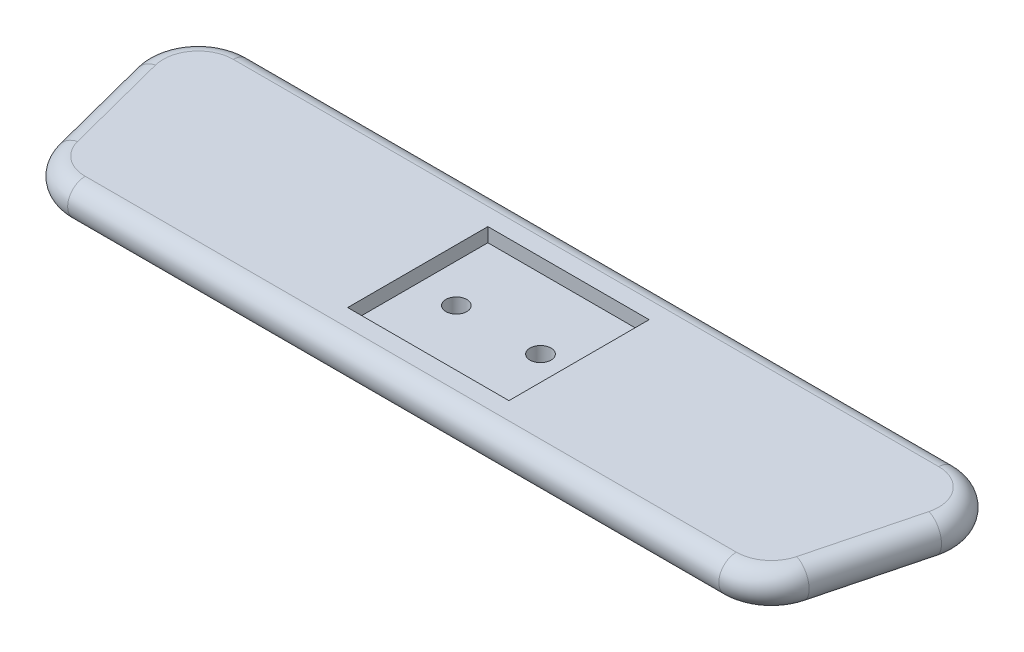
ISO-10303-21;
HEADER;
FILE_DESCRIPTION(('STEP AP214'),'2;1');
FILE_NAME('part.step','',(''),(''),'','','');
FILE_SCHEMA(('AUTOMOTIVE_DESIGN { 1 0 10303 214 1 1 1 1 }'));
ENDSEC;
DATA;
#1=APPLICATION_CONTEXT('core data for automotive mechanical design processes');
#2=APPLICATION_PROTOCOL_DEFINITION('international standard','automotive_design',2000,#1);
#3=PRODUCT_CONTEXT('',#1,'mechanical');
#4=PRODUCT('Part','Part','',(#3));
#5=PRODUCT_RELATED_PRODUCT_CATEGORY('part','',(#4));
#6=PRODUCT_DEFINITION_FORMATION('','',#4);
#7=PRODUCT_DEFINITION_CONTEXT('part definition',#1,'design');
#8=PRODUCT_DEFINITION('design','',#6,#7);
#9=PRODUCT_DEFINITION_SHAPE('','',#8);
#10=(LENGTH_UNIT() NAMED_UNIT(*) SI_UNIT(.MILLI.,.METRE.));
#11=(NAMED_UNIT(*) PLANE_ANGLE_UNIT() SI_UNIT($,.RADIAN.));
#12=(NAMED_UNIT(*) SI_UNIT($,.STERADIAN.) SOLID_ANGLE_UNIT());
#13=UNCERTAINTY_MEASURE_WITH_UNIT(LENGTH_MEASURE(1.E-05),#10,'distance_accuracy_value','');
#14=(GEOMETRIC_REPRESENTATION_CONTEXT(3) GLOBAL_UNCERTAINTY_ASSIGNED_CONTEXT((#13)) GLOBAL_UNIT_ASSIGNED_CONTEXT((#10,
#11,#12)) REPRESENTATION_CONTEXT('',''));
#15=CARTESIAN_POINT('',(0.,0.,0.));
#16=DIRECTION('',(0.,0.,1.));
#17=DIRECTION('',(1.,0.,0.));
#18=AXIS2_PLACEMENT_3D('',#15,#16,#17);
#19=CARTESIAN_POINT('',(-92.8687040210194,5.,25.));
#20=DIRECTION('',(1.,0.,0.));
#21=DIRECTION('',(0.,0.,-1.));
#22=AXIS2_PLACEMENT_3D('',#19,#20,#21);
#23=CYLINDRICAL_SURFACE('',#22,5.);
#24=CARTESIAN_POINT('',(92.8687040210193,5.,25.));
#25=DIRECTION('',(1.,0.,0.));
#26=DIRECTION('',(0.,0.,-1.));
#27=AXIS2_PLACEMENT_3D('',#24,#25,#26);
#28=CIRCLE('',#27,5.);
#29=CARTESIAN_POINT('',(92.8687040210193,10.,25.));
#30=VERTEX_POINT('',#29);
#31=CARTESIAN_POINT('',(92.8687040210193,0.,25.));
#32=VERTEX_POINT('',#31);
#33=EDGE_CURVE('E11',#30,#32,#28,.T.);
#34=ORIENTED_EDGE('',*,*,#33,.F.);
#35=DIRECTION('',(-1.,0.,0.));
#36=VECTOR('',#35,1.);
#37=CARTESIAN_POINT('',(-92.8687040210194,10.,25.));
#38=LINE('',#37,#36);
#39=CARTESIAN_POINT('',(-92.8687040210194,10.,25.));
#40=VERTEX_POINT('',#39);
#41=EDGE_CURVE('E165',#40,#30,#38,.F.);
#42=ORIENTED_EDGE('',*,*,#41,.F.);
#43=CARTESIAN_POINT('',(-92.8687040210194,5.,25.));
#44=DIRECTION('',(1.,0.,0.));
#45=DIRECTION('',(0.,0.,-1.));
#46=AXIS2_PLACEMENT_3D('',#43,#44,#45);
#47=CIRCLE('',#46,5.);
#48=CARTESIAN_POINT('',(-92.8687040210194,0.,25.));
#49=VERTEX_POINT('',#48);
#50=EDGE_CURVE('E42',#40,#49,#47,.T.);
#51=ORIENTED_EDGE('',*,*,#50,.T.);
#52=DIRECTION('',(1.,0.,0.));
#53=VECTOR('',#52,1.);
#54=CARTESIAN_POINT('',(-100.627231551696,0.,25.));
#55=LINE('',#54,#53);
#56=EDGE_CURVE('E198',#32,#49,#55,.F.);
#57=ORIENTED_EDGE('',*,*,#56,.F.);
#58=EDGE_LOOP('',(#34,#42,#51,#57));
#59=FACE_BOUND('',#58,.T.);
#60=ADVANCED_FACE('F34',(#59),#23,.T.);
#61=CARTESIAN_POINT('',(-92.8687040210195,5.,15.));
#62=DIRECTION('',(0.,1.,0.));
#63=DIRECTION('',(0.,0.,1.));
#64=AXIS2_PLACEMENT_3D('',#61,#62,#63);
#65=TOROIDAL_SURFACE('',#64,10.,5.);
#66=ORIENTED_EDGE('',*,*,#50,.F.);
#67=CARTESIAN_POINT('',(-92.8687040210195,10.,15.));
#68=DIRECTION('',(0.,1.,0.));
#69=DIRECTION('',(0.,0.,1.));
#70=AXIS2_PLACEMENT_3D('',#67,#68,#69);
#71=CIRCLE('',#70,10.);
#72=CARTESIAN_POINT('',(-102.550180424801,10.,17.5038000405444));
#73=VERTEX_POINT('',#72);
#74=EDGE_CURVE('E177',#73,#40,#71,.T.);
#75=ORIENTED_EDGE('',*,*,#74,.F.);
#76=CARTESIAN_POINT('',(-102.550180424801,5.,17.5038000405444));
#77=DIRECTION('',(0.250380004054439,0.,0.968147640378108));
#78=DIRECTION('',(0.968147640378108,0.,-0.250380004054439));
#79=AXIS2_PLACEMENT_3D('',#76,#77,#78);
#80=CIRCLE('',#79,5.);
#81=CARTESIAN_POINT('',(-102.550180424801,0.,17.5038000405444));
#82=VERTEX_POINT('',#81);
#83=EDGE_CURVE('E230',#73,#82,#80,.T.);
#84=ORIENTED_EDGE('',*,*,#83,.T.);
#85=CARTESIAN_POINT('',(-92.8687040210195,0.,15.));
#86=DIRECTION('',(0.,1.,0.));
#87=DIRECTION('',(0.,0.,1.));
#88=AXIS2_PLACEMENT_3D('',#85,#86,#87);
#89=CIRCLE('',#88,10.);
#90=EDGE_CURVE('E201',#49,#82,#89,.F.);
#91=ORIENTED_EDGE('',*,*,#90,.F.);
#92=EDGE_LOOP('',(#66,#75,#84,#91));
#93=FACE_BOUND('',#92,.T.);
#94=ADVANCED_FACE('F237',(#93),#65,.T.);
#95=CARTESIAN_POINT('',(-110.308707955477,5.,-12.4961999594555));
#96=DIRECTION('',(0.250380004054446,0.,0.968147640378107));
#97=DIRECTION('',(0.968147640378107,0.,-0.250380004054446));
#98=AXIS2_PLACEMENT_3D('',#95,#96,#97);
#99=CYLINDRICAL_SURFACE('',#98,5.);
#100=ORIENTED_EDGE('',*,*,#83,.F.);
#101=DIRECTION('',(-0.250380004054446,0.,-0.968147640378107));
#102=VECTOR('',#101,1.);
#103=CARTESIAN_POINT('',(-110.308707955477,10.,-12.4961999594555));
#104=LINE('',#103,#102);
#105=CARTESIAN_POINT('',(-110.308707955477,10.,-12.4961999594555));
#106=VERTEX_POINT('',#105);
#107=EDGE_CURVE('E180',#106,#73,#104,.F.);
#108=ORIENTED_EDGE('',*,*,#107,.F.);
#109=CARTESIAN_POINT('',(-110.308707955477,5.,-12.4961999594555));
#110=DIRECTION('',(0.250380004054454,0.,0.968147640378105));
#111=DIRECTION('',(0.968147640378105,0.,-0.250380004054454));
#112=AXIS2_PLACEMENT_3D('',#109,#110,#111);
#113=CIRCLE('',#112,5.);
#114=CARTESIAN_POINT('',(-110.308707955477,0.,-12.4961999594555));
#115=VERTEX_POINT('',#114);
#116=EDGE_CURVE('E228',#106,#115,#113,.T.);
#117=ORIENTED_EDGE('',*,*,#116,.T.);
#118=DIRECTION('',(0.250380004054446,0.,0.968147640378107));
#119=VECTOR('',#118,1.);
#120=CARTESIAN_POINT('',(-110.308707955477,0.,-12.4961999594555));
#121=LINE('',#120,#119);
#122=EDGE_CURVE('E204',#82,#115,#121,.F.);
#123=ORIENTED_EDGE('',*,*,#122,.F.);
#124=EDGE_LOOP('',(#100,#108,#117,#123));
#125=FACE_BOUND('',#124,.T.);
#126=ADVANCED_FACE('F251',(#125),#99,.T.);
#127=CARTESIAN_POINT('',(-100.627231551696,5.,-15.));
#128=DIRECTION('',(0.,1.,0.));
#129=DIRECTION('',(0.,0.,1.));
#130=AXIS2_PLACEMENT_3D('',#127,#128,#129);
#131=TOROIDAL_SURFACE('',#130,10.,5.);
#132=ORIENTED_EDGE('',*,*,#116,.F.);
#133=CARTESIAN_POINT('',(-100.627231551696,10.,-15.));
#134=DIRECTION('',(0.,1.,0.));
#135=DIRECTION('',(0.,0.,1.));
#136=AXIS2_PLACEMENT_3D('',#133,#134,#135);
#137=CIRCLE('',#136,10.);
#138=CARTESIAN_POINT('',(-100.627231551696,10.,-25.));
#139=VERTEX_POINT('',#138);
#140=EDGE_CURVE('E183',#139,#106,#137,.T.);
#141=ORIENTED_EDGE('',*,*,#140,.F.);
#142=CARTESIAN_POINT('',(-100.627231551696,5.,-25.));
#143=DIRECTION('',(-1.,0.,0.));
#144=DIRECTION('',(0.,0.,1.));
#145=AXIS2_PLACEMENT_3D('',#142,#143,#144);
#146=CIRCLE('',#145,5.);
#147=CARTESIAN_POINT('',(-100.627231551696,0.,-25.));
#148=VERTEX_POINT('',#147);
#149=EDGE_CURVE('E226',#139,#148,#146,.T.);
#150=ORIENTED_EDGE('',*,*,#149,.T.);
#151=CARTESIAN_POINT('',(-100.627231551696,0.,-15.));
#152=DIRECTION('',(0.,1.,0.));
#153=DIRECTION('',(0.,0.,1.));
#154=AXIS2_PLACEMENT_3D('',#151,#152,#153);
#155=CIRCLE('',#154,10.);
#156=EDGE_CURVE('E207',#115,#148,#155,.F.);
#157=ORIENTED_EDGE('',*,*,#156,.F.);
#158=EDGE_LOOP('',(#132,#141,#150,#157));
#159=FACE_BOUND('',#158,.T.);
#160=ADVANCED_FACE('F255',(#159),#131,.T.);
#161=CARTESIAN_POINT('',(100.627231551696,5.,-25.));
#162=DIRECTION('',(-1.,0.,0.));
#163=DIRECTION('',(0.,0.,1.));
#164=AXIS2_PLACEMENT_3D('',#161,#162,#163);
#165=CYLINDRICAL_SURFACE('',#164,5.);
#166=ORIENTED_EDGE('',*,*,#149,.F.);
#167=DIRECTION('',(-1.,0.,0.));
#168=VECTOR('',#167,1.);
#169=CARTESIAN_POINT('',(-100.627231551696,10.,-25.));
#170=LINE('',#169,#168);
#171=CARTESIAN_POINT('',(100.627231551696,10.,-25.));
#172=VERTEX_POINT('',#171);
#173=EDGE_CURVE('E186',#172,#139,#170,.T.);
#174=ORIENTED_EDGE('',*,*,#173,.F.);
#175=CARTESIAN_POINT('',(100.627231551696,5.,-25.));
#176=DIRECTION('',(-1.,0.,0.));
#177=DIRECTION('',(0.,0.,1.));
#178=AXIS2_PLACEMENT_3D('',#175,#176,#177);
#179=CIRCLE('',#178,5.);
#180=CARTESIAN_POINT('',(100.627231551696,0.,-25.));
#181=VERTEX_POINT('',#180);
#182=EDGE_CURVE('E224',#172,#181,#179,.T.);
#183=ORIENTED_EDGE('',*,*,#182,.T.);
#184=DIRECTION('',(1.,0.,0.));
#185=VECTOR('',#184,1.);
#186=CARTESIAN_POINT('',(100.627231551696,0.,-25.));
#187=LINE('',#186,#185);
#188=EDGE_CURVE('E210',#148,#181,#187,.T.);
#189=ORIENTED_EDGE('',*,*,#188,.F.);
#190=EDGE_LOOP('',(#166,#174,#183,#189));
#191=FACE_BOUND('',#190,.T.);
#192=ADVANCED_FACE('F258',(#191),#165,.T.);
#193=CARTESIAN_POINT('',(100.627231551696,5.,-15.));
#194=DIRECTION('',(0.,1.,0.));
#195=DIRECTION('',(0.,0.,1.));
#196=AXIS2_PLACEMENT_3D('',#193,#194,#195);
#197=TOROIDAL_SURFACE('',#196,10.,5.);
#198=ORIENTED_EDGE('',*,*,#182,.F.);
#199=CARTESIAN_POINT('',(100.627231551696,10.,-15.));
#200=DIRECTION('',(0.,1.,0.));
#201=DIRECTION('',(0.,0.,1.));
#202=AXIS2_PLACEMENT_3D('',#199,#200,#201);
#203=CIRCLE('',#202,10.);
#204=CARTESIAN_POINT('',(110.308707955477,10.,-12.4961999594554));
#205=VERTEX_POINT('',#204);
#206=EDGE_CURVE('E189',#205,#172,#203,.T.);
#207=ORIENTED_EDGE('',*,*,#206,.F.);
#208=CARTESIAN_POINT('',(110.308707955477,5.,-12.4961999594554));
#209=DIRECTION('',(0.250380004054446,0.,-0.968147640378107));
#210=DIRECTION('',(-0.968147640378107,0.,-0.250380004054446));
#211=AXIS2_PLACEMENT_3D('',#208,#209,#210);
#212=CIRCLE('',#211,5.);
#213=CARTESIAN_POINT('',(110.308707955477,0.,-12.4961999594554));
#214=VERTEX_POINT('',#213);
#215=EDGE_CURVE('E57',#205,#214,#212,.T.);
#216=ORIENTED_EDGE('',*,*,#215,.T.);
#217=CARTESIAN_POINT('',(100.627231551696,0.,-15.));
#218=DIRECTION('',(0.,1.,0.));
#219=DIRECTION('',(0.,0.,1.));
#220=AXIS2_PLACEMENT_3D('',#217,#218,#219);
#221=CIRCLE('',#220,10.);
#222=EDGE_CURVE('E213',#181,#214,#221,.F.);
#223=ORIENTED_EDGE('',*,*,#222,.F.);
#224=EDGE_LOOP('',(#198,#207,#216,#223));
#225=FACE_BOUND('',#224,.T.);
#226=ADVANCED_FACE('F259',(#225),#197,.T.);
#227=CARTESIAN_POINT('',(102.5501804248,5.,17.5038000405444));
#228=DIRECTION('',(0.250380004054446,0.,-0.968147640378107));
#229=DIRECTION('',(-0.968147640378107,0.,-0.250380004054446));
#230=AXIS2_PLACEMENT_3D('',#227,#228,#229);
#231=CYLINDRICAL_SURFACE('',#230,5.);
#232=ORIENTED_EDGE('',*,*,#215,.F.);
#233=DIRECTION('',(0.250380004054446,0.,-0.968147640378107));
#234=VECTOR('',#233,1.);
#235=CARTESIAN_POINT('',(97.6920361937733,10.,36.2888499555633));
#236=LINE('',#235,#234);
#237=CARTESIAN_POINT('',(102.5501804248,10.,17.5038000405444));
#238=VERTEX_POINT('',#237);
#239=EDGE_CURVE('E192',#238,#205,#236,.T.);
#240=ORIENTED_EDGE('',*,*,#239,.F.);
#241=CARTESIAN_POINT('',(102.5501804248,5.,17.5038000405444));
#242=DIRECTION('',(0.25038000405444,0.,-0.968147640378108));
#243=DIRECTION('',(-0.968147640378108,0.,-0.25038000405444));
#244=AXIS2_PLACEMENT_3D('',#241,#242,#243);
#245=CIRCLE('',#244,5.);
#246=CARTESIAN_POINT('',(102.5501804248,0.,17.5038000405444));
#247=VERTEX_POINT('',#246);
#248=EDGE_CURVE('E49',#238,#247,#245,.T.);
#249=ORIENTED_EDGE('',*,*,#248,.T.);
#250=DIRECTION('',(-0.250380004054446,0.,0.968147640378107));
#251=VECTOR('',#250,1.);
#252=CARTESIAN_POINT('',(102.5501804248,0.,17.5038000405444));
#253=LINE('',#252,#251);
#254=EDGE_CURVE('E216',#214,#247,#253,.T.);
#255=ORIENTED_EDGE('',*,*,#254,.F.);
#256=EDGE_LOOP('',(#232,#240,#249,#255));
#257=FACE_BOUND('',#256,.T.);
#258=ADVANCED_FACE('F261',(#257),#231,.T.);
#259=CARTESIAN_POINT('',(92.8687040210194,5.,15.));
#260=DIRECTION('',(0.,1.,0.));
#261=DIRECTION('',(0.,0.,1.));
#262=AXIS2_PLACEMENT_3D('',#259,#260,#261);
#263=TOROIDAL_SURFACE('',#262,10.,5.);
#264=CARTESIAN_POINT('',(92.8687040210194,10.,15.));
#265=DIRECTION('',(0.,1.,0.));
#266=DIRECTION('',(0.,0.,1.));
#267=AXIS2_PLACEMENT_3D('',#264,#265,#266);
#268=CIRCLE('',#267,10.);
#269=EDGE_CURVE('E195',#30,#238,#268,.T.);
#270=ORIENTED_EDGE('',*,*,#269,.F.);
#271=ORIENTED_EDGE('',*,*,#33,.T.);
#272=CARTESIAN_POINT('',(92.8687040210194,0.,15.));
#273=DIRECTION('',(0.,1.,0.));
#274=DIRECTION('',(0.,0.,1.));
#275=AXIS2_PLACEMENT_3D('',#272,#273,#274);
#276=CIRCLE('',#275,10.);
#277=EDGE_CURVE('E219',#247,#32,#276,.F.);
#278=ORIENTED_EDGE('',*,*,#277,.F.);
#279=ORIENTED_EDGE('',*,*,#248,.F.);
#280=EDGE_LOOP('',(#270,#271,#278,#279));
#281=FACE_BOUND('',#280,.T.);
#282=ADVANCED_FACE('F244',(#281),#263,.T.);
#283=CARTESIAN_POINT('',(-100.627231551696,10.,-15.));
#284=DIRECTION('',(0.,1.,0.));
#285=DIRECTION('',(0.,0.,1.));
#286=AXIS2_PLACEMENT_3D('',#283,#284,#285);
#287=PLANE('',#286);
#288=ORIENTED_EDGE('',*,*,#41,.T.);
#289=ORIENTED_EDGE('',*,*,#269,.T.);
#290=ORIENTED_EDGE('',*,*,#239,.T.);
#291=ORIENTED_EDGE('',*,*,#206,.T.);
#292=ORIENTED_EDGE('',*,*,#173,.T.);
#293=ORIENTED_EDGE('',*,*,#140,.T.);
#294=ORIENTED_EDGE('',*,*,#107,.T.);
#295=ORIENTED_EDGE('',*,*,#74,.T.);
#296=EDGE_LOOP('',(#288,#289,#290,#291,#292,#293,#294,#295));
#297=FACE_BOUND('',#296,.T.);
#298=DIRECTION('',(0.,0.,1.));
#299=VECTOR('',#298,1.);
#300=CARTESIAN_POINT('',(-23.,10.,-20.));
#301=LINE('',#300,#299);
#302=CARTESIAN_POINT('',(-23.,10.,-20.));
#303=VERTEX_POINT('',#302);
#304=CARTESIAN_POINT('',(-23.,10.,20.));
#305=VERTEX_POINT('',#304);
#306=EDGE_CURVE('E129',#303,#305,#301,.T.);
#307=ORIENTED_EDGE('',*,*,#306,.F.);
#308=DIRECTION('',(1.,0.,0.));
#309=VECTOR('',#308,1.);
#310=CARTESIAN_POINT('',(-23.,10.,-20.));
#311=LINE('',#310,#309);
#312=CARTESIAN_POINT('',(23.,10.,-20.));
#313=VERTEX_POINT('',#312);
#314=EDGE_CURVE('E146',#303,#313,#311,.T.);
#315=ORIENTED_EDGE('',*,*,#314,.T.);
#316=DIRECTION('',(0.,0.,1.));
#317=VECTOR('',#316,1.);
#318=CARTESIAN_POINT('',(23.,10.,-20.));
#319=LINE('',#318,#317);
#320=CARTESIAN_POINT('',(23.,10.,20.));
#321=VERTEX_POINT('',#320);
#322=EDGE_CURVE('E149',#313,#321,#319,.T.);
#323=ORIENTED_EDGE('',*,*,#322,.T.);
#324=DIRECTION('',(1.,0.,0.));
#325=VECTOR('',#324,1.);
#326=CARTESIAN_POINT('',(-23.,10.,20.));
#327=LINE('',#326,#325);
#328=EDGE_CURVE('E158',#305,#321,#327,.T.);
#329=ORIENTED_EDGE('',*,*,#328,.F.);
#330=EDGE_LOOP('',(#307,#315,#323,#329));
#331=FACE_BOUND('',#330,.T.);
#332=ADVANCED_FACE('F246',(#297,#331),#287,.T.);
#333=CARTESIAN_POINT('',(-100.627231551696,0.,-15.));
#334=DIRECTION('',(0.,1.,0.));
#335=DIRECTION('',(0.,0.,1.));
#336=AXIS2_PLACEMENT_3D('',#333,#334,#335);
#337=PLANE('',#336);
#338=CARTESIAN_POINT('',(70.,0.,8.));
#339=DIRECTION('',(0.,-1.,0.));
#340=DIRECTION('',(0.,0.,1.));
#341=AXIS2_PLACEMENT_3D('',#338,#339,#340);
#342=CIRCLE('',#341,2.);
#343=CARTESIAN_POINT('',(70.,0.,10.));
#344=VERTEX_POINT('',#343);
#345=EDGE_CURVE('E385',#344,#344,#342,.T.);
#346=ORIENTED_EDGE('',*,*,#345,.F.);
#347=EDGE_LOOP('',(#346));
#348=FACE_BOUND('',#347,.T.);
#349=CARTESIAN_POINT('',(70.,0.,-8.));
#350=DIRECTION('',(0.,-1.,0.));
#351=DIRECTION('',(0.,0.,-1.));
#352=AXIS2_PLACEMENT_3D('',#349,#350,#351);
#353=CIRCLE('',#352,2.);
#354=CARTESIAN_POINT('',(70.,0.,-10.));
#355=VERTEX_POINT('',#354);
#356=EDGE_CURVE('E379',#355,#355,#353,.T.);
#357=ORIENTED_EDGE('',*,*,#356,.F.);
#358=EDGE_LOOP('',(#357));
#359=FACE_BOUND('',#358,.T.);
#360=CARTESIAN_POINT('',(-70.,0.,-8.));
#361=DIRECTION('',(0.,-1.,0.));
#362=DIRECTION('',(0.,0.,1.));
#363=AXIS2_PLACEMENT_3D('',#360,#361,#362);
#364=CIRCLE('',#363,2.);
#365=CARTESIAN_POINT('',(-70.,0.,-6.));
#366=VERTEX_POINT('',#365);
#367=EDGE_CURVE('E368',#366,#366,#364,.T.);
#368=ORIENTED_EDGE('',*,*,#367,.F.);
#369=EDGE_LOOP('',(#368));
#370=FACE_BOUND('',#369,.T.);
#371=CARTESIAN_POINT('',(-70.,0.,8.));
#372=DIRECTION('',(0.,-1.,0.));
#373=DIRECTION('',(0.,0.,-1.));
#374=AXIS2_PLACEMENT_3D('',#371,#372,#373);
#375=CIRCLE('',#374,2.);
#376=CARTESIAN_POINT('',(-70.,0.,6.));
#377=VERTEX_POINT('',#376);
#378=EDGE_CURVE('E367',#377,#377,#375,.T.);
#379=ORIENTED_EDGE('',*,*,#378,.F.);
#380=EDGE_LOOP('',(#379));
#381=FACE_BOUND('',#380,.T.);
#382=ORIENTED_EDGE('',*,*,#254,.T.);
#383=ORIENTED_EDGE('',*,*,#277,.T.);
#384=ORIENTED_EDGE('',*,*,#56,.T.);
#385=ORIENTED_EDGE('',*,*,#90,.T.);
#386=ORIENTED_EDGE('',*,*,#122,.T.);
#387=ORIENTED_EDGE('',*,*,#156,.T.);
#388=ORIENTED_EDGE('',*,*,#188,.T.);
#389=ORIENTED_EDGE('',*,*,#222,.T.);
#390=EDGE_LOOP('',(#382,#383,#384,#385,#386,#387,#388,#389));
#391=FACE_BOUND('',#390,.T.);
#392=CARTESIAN_POINT('',(-12.,0.,0.));
#393=DIRECTION('',(0.,1.,0.));
#394=DIRECTION('',(0.,0.,1.));
#395=AXIS2_PLACEMENT_3D('',#392,#393,#394);
#396=CIRCLE('',#395,3.);
#397=CARTESIAN_POINT('',(-12.,0.,3.));
#398=VERTEX_POINT('',#397);
#399=EDGE_CURVE('E172',#398,#398,#396,.T.);
#400=ORIENTED_EDGE('',*,*,#399,.T.);
#401=EDGE_LOOP('',(#400));
#402=FACE_BOUND('',#401,.T.);
#403=CARTESIAN_POINT('',(12.,0.,0.));
#404=DIRECTION('',(0.,1.,0.));
#405=DIRECTION('',(0.,0.,1.));
#406=AXIS2_PLACEMENT_3D('',#403,#404,#405);
#407=CIRCLE('',#406,3.);
#408=CARTESIAN_POINT('',(12.,0.,3.));
#409=VERTEX_POINT('',#408);
#410=EDGE_CURVE('E152',#409,#409,#407,.T.);
#411=ORIENTED_EDGE('',*,*,#410,.T.);
#412=EDGE_LOOP('',(#411));
#413=FACE_BOUND('',#412,.T.);
#414=ADVANCED_FACE('F240',(#348,#359,#370,#381,#391,#402,#413),#337,.F.);
#415=CARTESIAN_POINT('',(-23.,6.,-20.));
#416=DIRECTION('',(-1.,0.,0.));
#417=DIRECTION('',(0.,0.,1.));
#418=AXIS2_PLACEMENT_3D('',#415,#416,#417);
#419=PLANE('',#418);
#420=ORIENTED_EDGE('',*,*,#306,.T.);
#421=DIRECTION('',(0.,1.,0.));
#422=VECTOR('',#421,1.);
#423=CARTESIAN_POINT('',(-23.,6.,20.));
#424=LINE('',#423,#422);
#425=CARTESIAN_POINT('',(-23.,6.,20.));
#426=VERTEX_POINT('',#425);
#427=EDGE_CURVE('E123',#426,#305,#424,.T.);
#428=ORIENTED_EDGE('',*,*,#427,.F.);
#429=DIRECTION('',(0.,0.,1.));
#430=VECTOR('',#429,1.);
#431=CARTESIAN_POINT('',(-23.,6.,-20.));
#432=LINE('',#431,#430);
#433=CARTESIAN_POINT('',(-23.,6.,-20.));
#434=VERTEX_POINT('',#433);
#435=EDGE_CURVE('E127',#434,#426,#432,.T.);
#436=ORIENTED_EDGE('',*,*,#435,.F.);
#437=DIRECTION('',(0.,1.,0.));
#438=VECTOR('',#437,1.);
#439=CARTESIAN_POINT('',(-23.,6.,-20.));
#440=LINE('',#439,#438);
#441=EDGE_CURVE('E163',#434,#303,#440,.T.);
#442=ORIENTED_EDGE('',*,*,#441,.T.);
#443=EDGE_LOOP('',(#420,#428,#436,#442));
#444=FACE_BOUND('',#443,.T.);
#445=ADVANCED_FACE('F125',(#444),#419,.F.);
#446=CARTESIAN_POINT('',(-23.,6.,-20.));
#447=DIRECTION('',(0.,0.,1.));
#448=DIRECTION('',(1.,0.,0.));
#449=AXIS2_PLACEMENT_3D('',#446,#447,#448);
#450=PLANE('',#449);
#451=ORIENTED_EDGE('',*,*,#314,.F.);
#452=ORIENTED_EDGE('',*,*,#441,.F.);
#453=DIRECTION('',(1.,0.,0.));
#454=VECTOR('',#453,1.);
#455=CARTESIAN_POINT('',(-23.,6.,-20.));
#456=LINE('',#455,#454);
#457=CARTESIAN_POINT('',(23.,6.,-20.));
#458=VERTEX_POINT('',#457);
#459=EDGE_CURVE('E134',#434,#458,#456,.T.);
#460=ORIENTED_EDGE('',*,*,#459,.T.);
#461=DIRECTION('',(0.,1.,0.));
#462=VECTOR('',#461,1.);
#463=CARTESIAN_POINT('',(23.,6.,-20.));
#464=LINE('',#463,#462);
#465=EDGE_CURVE('E166',#458,#313,#464,.T.);
#466=ORIENTED_EDGE('',*,*,#465,.T.);
#467=EDGE_LOOP('',(#451,#452,#460,#466));
#468=FACE_BOUND('',#467,.T.);
#469=ADVANCED_FACE('F310',(#468),#450,.T.);
#470=CARTESIAN_POINT('',(23.,6.,-20.));
#471=DIRECTION('',(-1.,0.,0.));
#472=DIRECTION('',(0.,0.,1.));
#473=AXIS2_PLACEMENT_3D('',#470,#471,#472);
#474=PLANE('',#473);
#475=ORIENTED_EDGE('',*,*,#322,.F.);
#476=ORIENTED_EDGE('',*,*,#465,.F.);
#477=DIRECTION('',(0.,0.,1.));
#478=VECTOR('',#477,1.);
#479=CARTESIAN_POINT('',(23.,6.,-20.));
#480=LINE('',#479,#478);
#481=CARTESIAN_POINT('',(23.,6.,20.));
#482=VERTEX_POINT('',#481);
#483=EDGE_CURVE('E142',#458,#482,#480,.T.);
#484=ORIENTED_EDGE('',*,*,#483,.T.);
#485=DIRECTION('',(0.,1.,0.));
#486=VECTOR('',#485,1.);
#487=CARTESIAN_POINT('',(23.,6.,20.));
#488=LINE('',#487,#486);
#489=EDGE_CURVE('E133',#482,#321,#488,.T.);
#490=ORIENTED_EDGE('',*,*,#489,.T.);
#491=EDGE_LOOP('',(#475,#476,#484,#490));
#492=FACE_BOUND('',#491,.T.);
#493=ADVANCED_FACE('F313',(#492),#474,.T.);
#494=CARTESIAN_POINT('',(-23.,6.,20.));
#495=DIRECTION('',(0.,0.,1.));
#496=DIRECTION('',(1.,0.,0.));
#497=AXIS2_PLACEMENT_3D('',#494,#495,#496);
#498=PLANE('',#497);
#499=ORIENTED_EDGE('',*,*,#328,.T.);
#500=ORIENTED_EDGE('',*,*,#489,.F.);
#501=DIRECTION('',(1.,0.,0.));
#502=VECTOR('',#501,1.);
#503=CARTESIAN_POINT('',(-23.,6.,20.));
#504=LINE('',#503,#502);
#505=EDGE_CURVE('E138',#426,#482,#504,.T.);
#506=ORIENTED_EDGE('',*,*,#505,.F.);
#507=ORIENTED_EDGE('',*,*,#427,.T.);
#508=EDGE_LOOP('',(#499,#500,#506,#507));
#509=FACE_BOUND('',#508,.T.);
#510=ADVANCED_FACE('F139',(#509),#498,.F.);
#511=CARTESIAN_POINT('',(0.,6.,0.));
#512=DIRECTION('',(0.,1.,0.));
#513=DIRECTION('',(0.,0.,1.));
#514=AXIS2_PLACEMENT_3D('',#511,#512,#513);
#515=PLANE('',#514);
#516=CARTESIAN_POINT('',(-12.,6.,0.));
#517=DIRECTION('',(0.,1.,0.));
#518=DIRECTION('',(0.,0.,1.));
#519=AXIS2_PLACEMENT_3D('',#516,#517,#518);
#520=CIRCLE('',#519,3.);
#521=CARTESIAN_POINT('',(-12.,6.,3.));
#522=VERTEX_POINT('',#521);
#523=EDGE_CURVE('E159',#522,#522,#520,.T.);
#524=ORIENTED_EDGE('',*,*,#523,.F.);
#525=EDGE_LOOP('',(#524));
#526=FACE_BOUND('',#525,.T.);
#527=CARTESIAN_POINT('',(12.,6.,0.));
#528=DIRECTION('',(0.,1.,0.));
#529=DIRECTION('',(0.,0.,1.));
#530=AXIS2_PLACEMENT_3D('',#527,#528,#529);
#531=CIRCLE('',#530,3.);
#532=CARTESIAN_POINT('',(12.,6.,3.));
#533=VERTEX_POINT('',#532);
#534=EDGE_CURVE('E169',#533,#533,#531,.T.);
#535=ORIENTED_EDGE('',*,*,#534,.F.);
#536=EDGE_LOOP('',(#535));
#537=FACE_BOUND('',#536,.T.);
#538=ORIENTED_EDGE('',*,*,#435,.T.);
#539=ORIENTED_EDGE('',*,*,#505,.T.);
#540=ORIENTED_EDGE('',*,*,#483,.F.);
#541=ORIENTED_EDGE('',*,*,#459,.F.);
#542=EDGE_LOOP('',(#538,#539,#540,#541));
#543=FACE_BOUND('',#542,.T.);
#544=ADVANCED_FACE('F145',(#526,#537,#543),#515,.T.);
#545=CARTESIAN_POINT('',(12.,0.,0.));
#546=DIRECTION('',(0.,1.,0.));
#547=DIRECTION('',(0.,0.,1.));
#548=AXIS2_PLACEMENT_3D('',#545,#546,#547);
#549=CYLINDRICAL_SURFACE('',#548,3.);
#550=ORIENTED_EDGE('',*,*,#534,.T.);
#551=EDGE_LOOP('',(#550));
#552=FACE_BOUND('',#551,.T.);
#553=ORIENTED_EDGE('',*,*,#410,.F.);
#554=EDGE_LOOP('',(#553));
#555=FACE_BOUND('',#554,.T.);
#556=ADVANCED_FACE('F322',(#552,#555),#549,.F.);
#557=CARTESIAN_POINT('',(-12.,0.,0.));
#558=DIRECTION('',(0.,1.,0.));
#559=DIRECTION('',(0.,0.,1.));
#560=AXIS2_PLACEMENT_3D('',#557,#558,#559);
#561=CYLINDRICAL_SURFACE('',#560,3.);
#562=ORIENTED_EDGE('',*,*,#523,.T.);
#563=EDGE_LOOP('',(#562));
#564=FACE_BOUND('',#563,.T.);
#565=ORIENTED_EDGE('',*,*,#399,.F.);
#566=EDGE_LOOP('',(#565));
#567=FACE_BOUND('',#566,.T.);
#568=ADVANCED_FACE('F326',(#564,#567),#561,.F.);
#569=CARTESIAN_POINT('',(-70.,8.,8.));
#570=DIRECTION('',(0.,-1.,0.));
#571=DIRECTION('',(0.,0.,-1.));
#572=AXIS2_PLACEMENT_3D('',#569,#570,#571);
#573=CYLINDRICAL_SURFACE('',#572,2.);
#574=CARTESIAN_POINT('',(-70.,8.,8.));
#575=DIRECTION('',(0.,-1.,0.));
#576=DIRECTION('',(0.,0.,-1.));
#577=AXIS2_PLACEMENT_3D('',#574,#575,#576);
#578=CIRCLE('',#577,2.);
#579=CARTESIAN_POINT('',(-70.,8.,6.));
#580=VERTEX_POINT('',#579);
#581=EDGE_CURVE('E371',#580,#580,#578,.T.);
#582=ORIENTED_EDGE('',*,*,#581,.F.);
#583=EDGE_LOOP('',(#582));
#584=FACE_BOUND('',#583,.T.);
#585=ORIENTED_EDGE('',*,*,#378,.T.);
#586=EDGE_LOOP('',(#585));
#587=FACE_BOUND('',#586,.T.);
#588=ADVANCED_FACE('F330',(#584,#587),#573,.F.);
#589=CARTESIAN_POINT('',(-70.,8.,8.));
#590=DIRECTION('',(0.,-1.,0.));
#591=DIRECTION('',(0.,0.,-1.));
#592=AXIS2_PLACEMENT_3D('',#589,#590,#591);
#593=PLANE('',#592);
#594=ORIENTED_EDGE('',*,*,#581,.T.);
#595=EDGE_LOOP('',(#594));
#596=FACE_BOUND('',#595,.T.);
#597=ADVANCED_FACE('F334',(#596),#593,.T.);
#598=CARTESIAN_POINT('',(-70.,8.,-8.));
#599=DIRECTION('',(0.,-1.,0.));
#600=DIRECTION('',(0.,0.,-1.));
#601=AXIS2_PLACEMENT_3D('',#598,#599,#600);
#602=CYLINDRICAL_SURFACE('',#601,2.);
#603=CARTESIAN_POINT('',(-70.,8.,-8.));
#604=DIRECTION('',(0.,-1.,0.));
#605=DIRECTION('',(0.,0.,1.));
#606=AXIS2_PLACEMENT_3D('',#603,#604,#605);
#607=CIRCLE('',#606,2.);
#608=CARTESIAN_POINT('',(-70.,8.,-6.));
#609=VERTEX_POINT('',#608);
#610=EDGE_CURVE('E366',#609,#609,#607,.T.);
#611=ORIENTED_EDGE('',*,*,#610,.F.);
#612=EDGE_LOOP('',(#611));
#613=FACE_BOUND('',#612,.T.);
#614=ORIENTED_EDGE('',*,*,#367,.T.);
#615=EDGE_LOOP('',(#614));
#616=FACE_BOUND('',#615,.T.);
#617=ADVANCED_FACE('F338',(#613,#616),#602,.F.);
#618=CARTESIAN_POINT('',(-70.,8.,-8.));
#619=DIRECTION('',(0.,1.,0.));
#620=DIRECTION('',(0.,0.,1.));
#621=AXIS2_PLACEMENT_3D('',#618,#619,#620);
#622=PLANE('',#621);
#623=ORIENTED_EDGE('',*,*,#610,.T.);
#624=EDGE_LOOP('',(#623));
#625=FACE_BOUND('',#624,.T.);
#626=ADVANCED_FACE('F352',(#625),#622,.F.);
#627=CARTESIAN_POINT('',(70.,8.,-8.));
#628=DIRECTION('',(0.,-1.,0.));
#629=DIRECTION('',(0.,0.,-1.));
#630=AXIS2_PLACEMENT_3D('',#627,#628,#629);
#631=CYLINDRICAL_SURFACE('',#630,2.);
#632=CARTESIAN_POINT('',(70.,8.,-8.));
#633=DIRECTION('',(0.,-1.,0.));
#634=DIRECTION('',(0.,0.,-1.));
#635=AXIS2_PLACEMENT_3D('',#632,#633,#634);
#636=CIRCLE('',#635,2.);
#637=CARTESIAN_POINT('',(70.,8.,-10.));
#638=VERTEX_POINT('',#637);
#639=EDGE_CURVE('E374',#638,#638,#636,.T.);
#640=ORIENTED_EDGE('',*,*,#639,.F.);
#641=EDGE_LOOP('',(#640));
#642=FACE_BOUND('',#641,.T.);
#643=ORIENTED_EDGE('',*,*,#356,.T.);
#644=EDGE_LOOP('',(#643));
#645=FACE_BOUND('',#644,.T.);
#646=ADVANCED_FACE('F349',(#642,#645),#631,.F.);
#647=CARTESIAN_POINT('',(70.,8.,-8.));
#648=DIRECTION('',(0.,-1.,0.));
#649=DIRECTION('',(0.,0.,-1.));
#650=AXIS2_PLACEMENT_3D('',#647,#648,#649);
#651=PLANE('',#650);
#652=ORIENTED_EDGE('',*,*,#639,.T.);
#653=EDGE_LOOP('',(#652));
#654=FACE_BOUND('',#653,.T.);
#655=ADVANCED_FACE('F344',(#654),#651,.T.);
#656=CARTESIAN_POINT('',(70.,8.,8.));
#657=DIRECTION('',(0.,-1.,0.));
#658=DIRECTION('',(0.,0.,-1.));
#659=AXIS2_PLACEMENT_3D('',#656,#657,#658);
#660=CYLINDRICAL_SURFACE('',#659,2.);
#661=CARTESIAN_POINT('',(70.,8.,8.));
#662=DIRECTION('',(0.,-1.,0.));
#663=DIRECTION('',(0.,0.,1.));
#664=AXIS2_PLACEMENT_3D('',#661,#662,#663);
#665=CIRCLE('',#664,2.);
#666=CARTESIAN_POINT('',(70.,8.,10.));
#667=VERTEX_POINT('',#666);
#668=EDGE_CURVE('E382',#667,#667,#665,.T.);
#669=ORIENTED_EDGE('',*,*,#668,.F.);
#670=EDGE_LOOP('',(#669));
#671=FACE_BOUND('',#670,.T.);
#672=ORIENTED_EDGE('',*,*,#345,.T.);
#673=EDGE_LOOP('',(#672));
#674=FACE_BOUND('',#673,.T.);
#675=ADVANCED_FACE('F340',(#671,#674),#660,.F.);
#676=CARTESIAN_POINT('',(70.,8.,8.));
#677=DIRECTION('',(0.,1.,0.));
#678=DIRECTION('',(0.,0.,1.));
#679=AXIS2_PLACEMENT_3D('',#676,#677,#678);
#680=PLANE('',#679);
#681=ORIENTED_EDGE('',*,*,#668,.T.);
#682=EDGE_LOOP('',(#681));
#683=FACE_BOUND('',#682,.T.);
#684=ADVANCED_FACE('F343',(#683),#680,.F.);
#685=CLOSED_SHELL('',(#60,#94,#126,#160,#192,#226,#258,#282,#332,#414,#445,#469,#493,#510,#544,
#556,#568,#588,#597,#617,#626,#646,#655,#675,#684));
#686=MANIFOLD_SOLID_BREP('B2',#685);
#687=ADVANCED_BREP_SHAPE_REPRESENTATION('',(#18,#686),#14);
#688=SHAPE_DEFINITION_REPRESENTATION(#9,#687);
ENDSEC;
END-ISO-10303-21;
